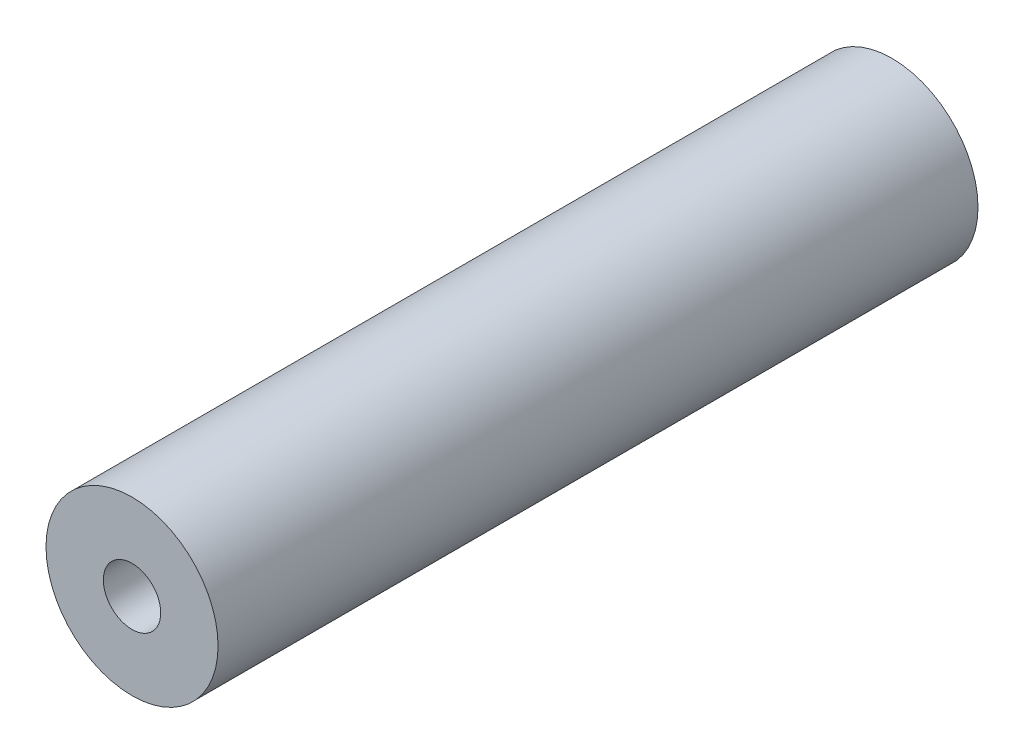
ISO-10303-21;
HEADER;
FILE_DESCRIPTION(('STEP AP214'),'2;1');
FILE_NAME('part.step','',(''),(''),'','','');
FILE_SCHEMA(('AUTOMOTIVE_DESIGN { 1 0 10303 214 1 1 1 1 }'));
ENDSEC;
DATA;
#1=APPLICATION_CONTEXT('core data for automotive mechanical design processes');
#2=APPLICATION_PROTOCOL_DEFINITION('international standard','automotive_design',2000,#1);
#3=PRODUCT_CONTEXT('',#1,'mechanical');
#4=PRODUCT('Part','Part','',(#3));
#5=PRODUCT_RELATED_PRODUCT_CATEGORY('part','',(#4));
#6=PRODUCT_DEFINITION_FORMATION('','',#4);
#7=PRODUCT_DEFINITION_CONTEXT('part definition',#1,'design');
#8=PRODUCT_DEFINITION('design','',#6,#7);
#9=PRODUCT_DEFINITION_SHAPE('','',#8);
#10=(LENGTH_UNIT() NAMED_UNIT(*) SI_UNIT(.MILLI.,.METRE.));
#11=(NAMED_UNIT(*) PLANE_ANGLE_UNIT() SI_UNIT($,.RADIAN.));
#12=(NAMED_UNIT(*) SI_UNIT($,.STERADIAN.) SOLID_ANGLE_UNIT());
#13=UNCERTAINTY_MEASURE_WITH_UNIT(LENGTH_MEASURE(1.E-05),#10,'distance_accuracy_value','');
#14=(GEOMETRIC_REPRESENTATION_CONTEXT(3) GLOBAL_UNCERTAINTY_ASSIGNED_CONTEXT((#13)) GLOBAL_UNIT_ASSIGNED_CONTEXT((#10,
#11,#12)) REPRESENTATION_CONTEXT('',''));
#15=CARTESIAN_POINT('',(0.,0.,0.));
#16=DIRECTION('',(0.,0.,1.));
#17=DIRECTION('',(1.,0.,0.));
#18=AXIS2_PLACEMENT_3D('',#15,#16,#17);
#19=CARTESIAN_POINT('',(0.,0.,26.5));
#20=DIRECTION('',(0.,0.,1.));
#21=DIRECTION('',(1.,0.,0.));
#22=AXIS2_PLACEMENT_3D('',#19,#20,#21);
#23=PLANE('',#22);
#24=CARTESIAN_POINT('',(0.,0.,26.5));
#25=DIRECTION('',(0.,0.,1.));
#26=DIRECTION('',(1.,0.,0.));
#27=AXIS2_PLACEMENT_3D('',#24,#25,#26);
#28=CIRCLE('',#27,3.);
#29=CARTESIAN_POINT('',(3.,0.,26.5));
#30=VERTEX_POINT('',#29);
#31=EDGE_CURVE('E10',#30,#30,#28,.T.);
#32=ORIENTED_EDGE('',*,*,#31,.T.);
#33=EDGE_LOOP('',(#32));
#34=FACE_BOUND('',#33,.T.);
#35=CARTESIAN_POINT('',(0.,0.,26.5));
#36=DIRECTION('',(0.,0.,1.));
#37=DIRECTION('',(1.,0.,0.));
#38=AXIS2_PLACEMENT_3D('',#35,#36,#37);
#39=CIRCLE('',#38,1.);
#40=CARTESIAN_POINT('',(1.,0.,26.5));
#41=VERTEX_POINT('',#40);
#42=EDGE_CURVE('E44',#41,#41,#39,.T.);
#43=ORIENTED_EDGE('',*,*,#42,.F.);
#44=EDGE_LOOP('',(#43));
#45=FACE_BOUND('',#44,.T.);
#46=ADVANCED_FACE('F33',(#34,#45),#23,.T.);
#47=CARTESIAN_POINT('',(0.,0.,0.));
#48=DIRECTION('',(0.,0.,1.));
#49=DIRECTION('',(1.,0.,0.));
#50=AXIS2_PLACEMENT_3D('',#47,#48,#49);
#51=PLANE('',#50);
#52=CARTESIAN_POINT('',(0.,0.,0.));
#53=DIRECTION('',(0.,0.,1.));
#54=DIRECTION('',(1.,0.,0.));
#55=AXIS2_PLACEMENT_3D('',#52,#53,#54);
#56=CIRCLE('',#55,3.);
#57=CARTESIAN_POINT('',(3.,0.,0.));
#58=VERTEX_POINT('',#57);
#59=EDGE_CURVE('E37',#58,#58,#56,.T.);
#60=ORIENTED_EDGE('',*,*,#59,.F.);
#61=EDGE_LOOP('',(#60));
#62=FACE_BOUND('',#61,.T.);
#63=CARTESIAN_POINT('',(0.,0.,0.));
#64=DIRECTION('',(0.,0.,1.));
#65=DIRECTION('',(1.,0.,0.));
#66=AXIS2_PLACEMENT_3D('',#63,#64,#65);
#67=CIRCLE('',#66,1.);
#68=CARTESIAN_POINT('',(1.,0.,0.));
#69=VERTEX_POINT('',#68);
#70=EDGE_CURVE('E46',#69,#69,#67,.T.);
#71=ORIENTED_EDGE('',*,*,#70,.T.);
#72=EDGE_LOOP('',(#71));
#73=FACE_BOUND('',#72,.T.);
#74=ADVANCED_FACE('F56',(#62,#73),#51,.F.);
#75=CARTESIAN_POINT('',(0.,0.,26.5));
#76=DIRECTION('',(0.,0.,-1.));
#77=DIRECTION('',(-1.,0.,0.));
#78=AXIS2_PLACEMENT_3D('',#75,#76,#77);
#79=CYLINDRICAL_SURFACE('',#78,3.);
#80=ORIENTED_EDGE('',*,*,#31,.F.);
#81=EDGE_LOOP('',(#80));
#82=FACE_BOUND('',#81,.T.);
#83=ORIENTED_EDGE('',*,*,#59,.T.);
#84=EDGE_LOOP('',(#83));
#85=FACE_BOUND('',#84,.T.);
#86=ADVANCED_FACE('F35',(#82,#85),#79,.T.);
#87=CARTESIAN_POINT('',(0.,0.,26.5));
#88=DIRECTION('',(0.,0.,-1.));
#89=DIRECTION('',(-1.,0.,0.));
#90=AXIS2_PLACEMENT_3D('',#87,#88,#89);
#91=CYLINDRICAL_SURFACE('',#90,1.);
#92=ORIENTED_EDGE('',*,*,#42,.T.);
#93=EDGE_LOOP('',(#92));
#94=FACE_BOUND('',#93,.T.);
#95=ORIENTED_EDGE('',*,*,#70,.F.);
#96=EDGE_LOOP('',(#95));
#97=FACE_BOUND('',#96,.T.);
#98=ADVANCED_FACE('F52',(#94,#97),#91,.F.);
#99=CLOSED_SHELL('',(#46,#74,#86,#98));
#100=MANIFOLD_SOLID_BREP('B2',#99);
#101=ADVANCED_BREP_SHAPE_REPRESENTATION('',(#18,#100),#14);
#102=SHAPE_DEFINITION_REPRESENTATION(#9,#101);
ENDSEC;
END-ISO-10303-21;
